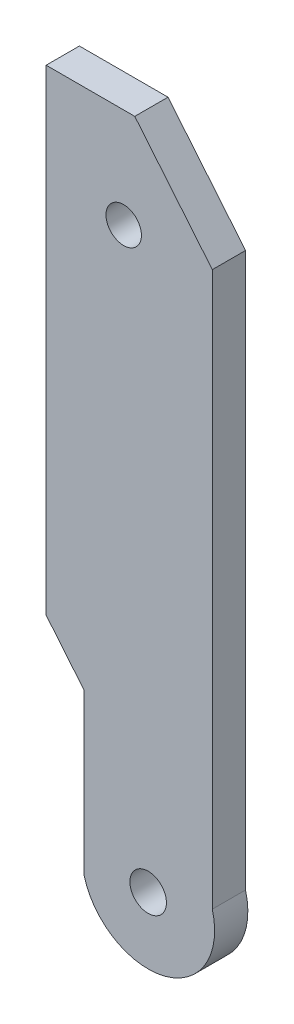
ISO-10303-21;
HEADER;
FILE_DESCRIPTION(('STEP AP214'),'2;1');
FILE_NAME('part.step','',(''),(''),'','','');
FILE_SCHEMA(('AUTOMOTIVE_DESIGN { 1 0 10303 214 1 1 1 1 }'));
ENDSEC;
DATA;
#1=APPLICATION_CONTEXT('core data for automotive mechanical design processes');
#2=APPLICATION_PROTOCOL_DEFINITION('international standard','automotive_design',2000,#1);
#3=PRODUCT_CONTEXT('',#1,'mechanical');
#4=PRODUCT('Part','Part','',(#3));
#5=PRODUCT_RELATED_PRODUCT_CATEGORY('part','',(#4));
#6=PRODUCT_DEFINITION_FORMATION('','',#4);
#7=PRODUCT_DEFINITION_CONTEXT('part definition',#1,'design');
#8=PRODUCT_DEFINITION('design','',#6,#7);
#9=PRODUCT_DEFINITION_SHAPE('','',#8);
#10=(LENGTH_UNIT() NAMED_UNIT(*) SI_UNIT(.MILLI.,.METRE.));
#11=(NAMED_UNIT(*) PLANE_ANGLE_UNIT() SI_UNIT($,.RADIAN.));
#12=(NAMED_UNIT(*) SI_UNIT($,.STERADIAN.) SOLID_ANGLE_UNIT());
#13=UNCERTAINTY_MEASURE_WITH_UNIT(LENGTH_MEASURE(1.E-05),#10,'distance_accuracy_value','');
#14=(GEOMETRIC_REPRESENTATION_CONTEXT(3) GLOBAL_UNCERTAINTY_ASSIGNED_CONTEXT((#13)) GLOBAL_UNIT_ASSIGNED_CONTEXT((#10,
#11,#12)) REPRESENTATION_CONTEXT('',''));
#15=CARTESIAN_POINT('',(0.,0.,0.));
#16=DIRECTION('',(0.,0.,1.));
#17=DIRECTION('',(1.,0.,0.));
#18=AXIS2_PLACEMENT_3D('',#15,#16,#17);
#19=CARTESIAN_POINT('',(28.4405752225166,38.0127221566126,3.));
#20=DIRECTION('',(0.,0.,-1.));
#21=DIRECTION('',(-1.,0.,0.));
#22=AXIS2_PLACEMENT_3D('',#19,#20,#21);
#23=CYLINDRICAL_SURFACE('',#22,6.00000000000001);
#24=CARTESIAN_POINT('',(28.4405752225166,38.0127221566126,0.));
#25=DIRECTION('',(0.,0.,1.));
#26=DIRECTION('',(1.,0.,0.));
#27=AXIS2_PLACEMENT_3D('',#24,#25,#26);
#28=CIRCLE('',#27,6.00000000000001);
#29=CARTESIAN_POINT('',(34.23086743438,39.5851457958505,0.));
#30=VERTEX_POINT('',#29);
#31=CARTESIAN_POINT('',(22.6502830106532,36.4402985173747,0.));
#32=VERTEX_POINT('',#31);
#33=EDGE_CURVE('E141',#30,#32,#28,.F.);
#34=ORIENTED_EDGE('',*,*,#33,.F.);
#35=DIRECTION('',(0.,0.,-1.));
#36=VECTOR('',#35,1.);
#37=CARTESIAN_POINT('',(34.23086743438,39.5851457958505,3.));
#38=LINE('',#37,#36);
#39=CARTESIAN_POINT('',(34.23086743438,39.5851457958505,3.));
#40=VERTEX_POINT('',#39);
#41=EDGE_CURVE('E11',#40,#30,#38,.T.);
#42=ORIENTED_EDGE('',*,*,#41,.F.);
#43=CARTESIAN_POINT('',(28.4405752225166,38.0127221566126,3.));
#44=DIRECTION('',(0.,0.,1.));
#45=DIRECTION('',(1.,0.,0.));
#46=AXIS2_PLACEMENT_3D('',#43,#44,#45);
#47=CIRCLE('',#46,6.00000000000001);
#48=CARTESIAN_POINT('',(22.6502830106532,36.4402985173747,3.));
#49=VERTEX_POINT('',#48);
#50=EDGE_CURVE('E205',#40,#49,#47,.F.);
#51=ORIENTED_EDGE('',*,*,#50,.T.);
#52=DIRECTION('',(0.,0.,-1.));
#53=VECTOR('',#52,1.);
#54=CARTESIAN_POINT('',(22.6502830106532,36.4402985173747,3.));
#55=LINE('',#54,#53);
#56=EDGE_CURVE('E82',#49,#32,#55,.T.);
#57=ORIENTED_EDGE('',*,*,#56,.T.);
#58=EDGE_LOOP('',(#34,#42,#51,#57));
#59=FACE_BOUND('',#58,.T.);
#60=ADVANCED_FACE('F34',(#59),#23,.T.);
#61=CARTESIAN_POINT('',(34.23086743438,0.,3.));
#62=DIRECTION('',(-1.,0.,0.));
#63=DIRECTION('',(0.,0.,1.));
#64=AXIS2_PLACEMENT_3D('',#61,#62,#63);
#65=PLANE('',#64);
#66=DIRECTION('',(0.,1.,0.));
#67=VECTOR('',#66,1.);
#68=CARTESIAN_POINT('',(34.23086743438,0.,0.));
#69=LINE('',#68,#67);
#70=CARTESIAN_POINT('',(34.23086743438,89.5851457958505,0.));
#71=VERTEX_POINT('',#70);
#72=EDGE_CURVE('E139',#30,#71,#69,.T.);
#73=ORIENTED_EDGE('',*,*,#72,.T.);
#74=DIRECTION('',(0.,0.,-1.));
#75=VECTOR('',#74,1.);
#76=CARTESIAN_POINT('',(34.23086743438,89.5851457958505,3.));
#77=LINE('',#76,#75);
#78=CARTESIAN_POINT('',(34.23086743438,89.5851457958505,3.));
#79=VERTEX_POINT('',#78);
#80=EDGE_CURVE('E43',#79,#71,#77,.T.);
#81=ORIENTED_EDGE('',*,*,#80,.F.);
#82=DIRECTION('',(0.,1.,0.));
#83=VECTOR('',#82,1.);
#84=CARTESIAN_POINT('',(34.23086743438,0.,3.));
#85=LINE('',#84,#83);
#86=EDGE_CURVE('E207',#40,#79,#85,.T.);
#87=ORIENTED_EDGE('',*,*,#86,.F.);
#88=ORIENTED_EDGE('',*,*,#41,.T.);
#89=EDGE_LOOP('',(#73,#81,#87,#88));
#90=FACE_BOUND('',#89,.T.);
#91=ADVANCED_FACE('F140',(#90),#65,.F.);
#92=CARTESIAN_POINT('',(64.3446994916133,53.0816689012521,3.));
#93=DIRECTION('',(-0.77138921583987,-0.636363636363636,0.));
#94=DIRECTION('',(0.636363636363636,-0.77138921583987,0.));
#95=AXIS2_PLACEMENT_3D('',#92,#93,#94);
#96=PLANE('',#95);
#97=DIRECTION('',(-0.636363636363636,0.77138921583987,0.));
#98=VECTOR('',#97,1.);
#99=CARTESIAN_POINT('',(64.3446994916133,53.0816689012521,0.));
#100=LINE('',#99,#98);
#101=CARTESIAN_POINT('',(27.23086743438,98.0704271700891,0.));
#102=VERTEX_POINT('',#101);
#103=EDGE_CURVE('E134',#71,#102,#100,.T.);
#104=ORIENTED_EDGE('',*,*,#103,.T.);
#105=DIRECTION('',(0.,0.,-1.));
#106=VECTOR('',#105,1.);
#107=CARTESIAN_POINT('',(27.23086743438,98.0704271700891,3.));
#108=LINE('',#107,#106);
#109=CARTESIAN_POINT('',(27.23086743438,98.0704271700891,3.));
#110=VERTEX_POINT('',#109);
#111=EDGE_CURVE('E121',#110,#102,#108,.T.);
#112=ORIENTED_EDGE('',*,*,#111,.F.);
#113=DIRECTION('',(-0.636363636363636,0.77138921583987,0.));
#114=VECTOR('',#113,1.);
#115=CARTESIAN_POINT('',(64.3446994916133,53.0816689012521,3.));
#116=LINE('',#115,#114);
#117=EDGE_CURVE('E135',#79,#110,#116,.T.);
#118=ORIENTED_EDGE('',*,*,#117,.F.);
#119=ORIENTED_EDGE('',*,*,#80,.T.);
#120=EDGE_LOOP('',(#104,#112,#118,#119));
#121=FACE_BOUND('',#120,.T.);
#122=ADVANCED_FACE('F132',(#121),#96,.F.);
#123=CARTESIAN_POINT('',(0.,98.0704271700891,3.));
#124=DIRECTION('',(0.,-1.,0.));
#125=DIRECTION('',(0.,0.,-1.));
#126=AXIS2_PLACEMENT_3D('',#123,#124,#125);
#127=PLANE('',#126);
#128=DIRECTION('',(-1.,0.,0.));
#129=VECTOR('',#128,1.);
#130=CARTESIAN_POINT('',(0.,98.0704271700891,0.));
#131=LINE('',#130,#129);
#132=CARTESIAN_POINT('',(19.23086743438,98.0704271700891,0.));
#133=VERTEX_POINT('',#132);
#134=EDGE_CURVE('E143',#102,#133,#131,.T.);
#135=ORIENTED_EDGE('',*,*,#134,.T.);
#136=DIRECTION('',(0.,0.,-1.));
#137=VECTOR('',#136,1.);
#138=CARTESIAN_POINT('',(19.23086743438,98.0704271700891,3.));
#139=LINE('',#138,#137);
#140=CARTESIAN_POINT('',(19.23086743438,98.0704271700891,3.));
#141=VERTEX_POINT('',#140);
#142=EDGE_CURVE('E119',#141,#133,#139,.T.);
#143=ORIENTED_EDGE('',*,*,#142,.F.);
#144=DIRECTION('',(-1.,0.,0.));
#145=VECTOR('',#144,1.);
#146=CARTESIAN_POINT('',(0.,98.0704271700891,3.));
#147=LINE('',#146,#145);
#148=EDGE_CURVE('E112',#110,#141,#147,.T.);
#149=ORIENTED_EDGE('',*,*,#148,.F.);
#150=ORIENTED_EDGE('',*,*,#111,.T.);
#151=EDGE_LOOP('',(#135,#143,#149,#150));
#152=FACE_BOUND('',#151,.T.);
#153=ADVANCED_FACE('F184',(#152),#127,.F.);
#154=CARTESIAN_POINT('',(19.23086743438,0.,3.));
#155=DIRECTION('',(1.,0.,0.));
#156=DIRECTION('',(0.,1.,0.));
#157=AXIS2_PLACEMENT_3D('',#154,#155,#156);
#158=PLANE('',#157);
#159=DIRECTION('',(0.,-1.,0.));
#160=VECTOR('',#159,1.);
#161=CARTESIAN_POINT('',(19.23086743438,0.,0.));
#162=LINE('',#161,#160);
#163=CARTESIAN_POINT('',(19.23086743438,55.070526621373,0.));
#164=VERTEX_POINT('',#163);
#165=EDGE_CURVE('E118',#133,#164,#162,.T.);
#166=ORIENTED_EDGE('',*,*,#165,.T.);
#167=DIRECTION('',(0.,0.,-1.));
#168=VECTOR('',#167,1.);
#169=CARTESIAN_POINT('',(19.23086743438,55.070526621373,3.));
#170=LINE('',#169,#168);
#171=CARTESIAN_POINT('',(19.23086743438,55.070526621373,3.));
#172=VERTEX_POINT('',#171);
#173=EDGE_CURVE('E104',#172,#164,#170,.T.);
#174=ORIENTED_EDGE('',*,*,#173,.F.);
#175=DIRECTION('',(0.,-1.,0.));
#176=VECTOR('',#175,1.);
#177=CARTESIAN_POINT('',(19.23086743438,0.,3.));
#178=LINE('',#177,#176);
#179=EDGE_CURVE('E107',#141,#172,#178,.T.);
#180=ORIENTED_EDGE('',*,*,#179,.F.);
#181=ORIENTED_EDGE('',*,*,#142,.T.);
#182=EDGE_LOOP('',(#166,#174,#180,#181));
#183=FACE_BOUND('',#182,.T.);
#184=ADVANCED_FACE('F117',(#183),#158,.F.);
#185=CARTESIAN_POINT('',(38.4764037350767,31.7414136628683,3.));
#186=DIRECTION('',(0.771389215839869,0.636363636363638,0.));
#187=DIRECTION('',(-0.636363636363638,0.771389215839869,0.));
#188=AXIS2_PLACEMENT_3D('',#185,#186,#187);
#189=PLANE('',#188);
#190=DIRECTION('',(0.636363636363638,-0.771389215839869,0.));
#191=VECTOR('',#190,1.);
#192=CARTESIAN_POINT('',(38.4764037350767,31.7414136628683,0.));
#193=LINE('',#192,#191);
#194=CARTESIAN_POINT('',(22.6502830106533,50.9255690070684,0.));
#195=VERTEX_POINT('',#194);
#196=EDGE_CURVE('E152',#164,#195,#193,.T.);
#197=ORIENTED_EDGE('',*,*,#196,.T.);
#198=DIRECTION('',(0.,0.,-1.));
#199=VECTOR('',#198,1.);
#200=CARTESIAN_POINT('',(22.6502830106533,50.9255690070684,3.));
#201=LINE('',#200,#199);
#202=CARTESIAN_POINT('',(22.6502830106533,50.9255690070684,3.));
#203=VERTEX_POINT('',#202);
#204=EDGE_CURVE('E106',#203,#195,#201,.T.);
#205=ORIENTED_EDGE('',*,*,#204,.F.);
#206=DIRECTION('',(0.636363636363638,-0.771389215839869,0.));
#207=VECTOR('',#206,1.);
#208=CARTESIAN_POINT('',(38.4764037350767,31.7414136628683,3.));
#209=LINE('',#208,#207);
#210=EDGE_CURVE('E99',#172,#203,#209,.T.);
#211=ORIENTED_EDGE('',*,*,#210,.F.);
#212=ORIENTED_EDGE('',*,*,#173,.T.);
#213=EDGE_LOOP('',(#197,#205,#211,#212));
#214=FACE_BOUND('',#213,.T.);
#215=ADVANCED_FACE('F102',(#214),#189,.F.);
#216=CARTESIAN_POINT('',(28.4405752225167,38.0127221566126,3.));
#217=DIRECTION('',(0.,0.,-1.));
#218=DIRECTION('',(-1.,0.,0.));
#219=AXIS2_PLACEMENT_3D('',#216,#217,#218);
#220=CYLINDRICAL_SURFACE('',#219,1.65);
#221=CARTESIAN_POINT('',(28.4405752225167,38.0127221566126,3.));
#222=DIRECTION('',(0.,0.,1.));
#223=DIRECTION('',(1.,0.,0.));
#224=AXIS2_PLACEMENT_3D('',#221,#222,#223);
#225=CIRCLE('',#224,1.65);
#226=CARTESIAN_POINT('',(30.0905752225167,38.0127221566126,3.));
#227=VERTEX_POINT('',#226);
#228=EDGE_CURVE('E204',#227,#227,#225,.T.);
#229=ORIENTED_EDGE('',*,*,#228,.T.);
#230=EDGE_LOOP('',(#229));
#231=FACE_BOUND('',#230,.T.);
#232=CARTESIAN_POINT('',(28.4405752225167,38.0127221566126,0.));
#233=DIRECTION('',(0.,0.,1.));
#234=DIRECTION('',(1.,0.,0.));
#235=AXIS2_PLACEMENT_3D('',#232,#233,#234);
#236=CIRCLE('',#235,1.65);
#237=CARTESIAN_POINT('',(30.0905752225167,38.0127221566126,0.));
#238=VERTEX_POINT('',#237);
#239=EDGE_CURVE('E145',#238,#238,#236,.T.);
#240=ORIENTED_EDGE('',*,*,#239,.F.);
#241=EDGE_LOOP('',(#240));
#242=FACE_BOUND('',#241,.T.);
#243=ADVANCED_FACE('F164',(#231,#242),#220,.F.);
#244=CARTESIAN_POINT('',(26.2308674343795,89.0704271700891,3.));
#245=DIRECTION('',(0.,0.,-1.));
#246=DIRECTION('',(-1.,0.,0.));
#247=AXIS2_PLACEMENT_3D('',#244,#245,#246);
#248=CYLINDRICAL_SURFACE('',#247,1.60000000000001);
#249=CARTESIAN_POINT('',(26.2308674343795,89.0704271700891,3.));
#250=DIRECTION('',(0.,0.,1.));
#251=DIRECTION('',(1.,0.,0.));
#252=AXIS2_PLACEMENT_3D('',#249,#250,#251);
#253=CIRCLE('',#252,1.60000000000001);
#254=CARTESIAN_POINT('',(27.8308674343795,89.0704271700891,3.));
#255=VERTEX_POINT('',#254);
#256=EDGE_CURVE('E154',#255,#255,#253,.T.);
#257=ORIENTED_EDGE('',*,*,#256,.T.);
#258=EDGE_LOOP('',(#257));
#259=FACE_BOUND('',#258,.T.);
#260=CARTESIAN_POINT('',(26.2308674343795,89.0704271700891,0.));
#261=DIRECTION('',(0.,0.,1.));
#262=DIRECTION('',(1.,0.,0.));
#263=AXIS2_PLACEMENT_3D('',#260,#261,#262);
#264=CIRCLE('',#263,1.60000000000001);
#265=CARTESIAN_POINT('',(27.8308674343795,89.0704271700891,0.));
#266=VERTEX_POINT('',#265);
#267=EDGE_CURVE('E157',#266,#266,#264,.T.);
#268=ORIENTED_EDGE('',*,*,#267,.F.);
#269=EDGE_LOOP('',(#268));
#270=FACE_BOUND('',#269,.T.);
#271=ADVANCED_FACE('F36',(#259,#270),#248,.F.);
#272=CARTESIAN_POINT('',(22.6502830106532,0.,3.));
#273=DIRECTION('',(1.,0.,0.));
#274=DIRECTION('',(0.,1.,0.));
#275=AXIS2_PLACEMENT_3D('',#272,#273,#274);
#276=PLANE('',#275);
#277=DIRECTION('',(0.,-1.,0.));
#278=VECTOR('',#277,1.);
#279=CARTESIAN_POINT('',(22.6502830106532,0.,0.));
#280=LINE('',#279,#278);
#281=EDGE_CURVE('E75',#195,#32,#280,.T.);
#282=ORIENTED_EDGE('',*,*,#281,.T.);
#283=ORIENTED_EDGE('',*,*,#56,.F.);
#284=DIRECTION('',(0.,-1.,0.));
#285=VECTOR('',#284,1.);
#286=CARTESIAN_POINT('',(22.6502830106532,0.,3.));
#287=LINE('',#286,#285);
#288=EDGE_CURVE('E51',#203,#49,#287,.T.);
#289=ORIENTED_EDGE('',*,*,#288,.F.);
#290=ORIENTED_EDGE('',*,*,#204,.T.);
#291=EDGE_LOOP('',(#282,#283,#289,#290));
#292=FACE_BOUND('',#291,.T.);
#293=ADVANCED_FACE('F171',(#292),#276,.F.);
#294=CARTESIAN_POINT('',(0.,0.,3.));
#295=DIRECTION('',(0.,0.,1.));
#296=DIRECTION('',(1.,0.,0.));
#297=AXIS2_PLACEMENT_3D('',#294,#295,#296);
#298=PLANE('',#297);
#299=ORIENTED_EDGE('',*,*,#256,.F.);
#300=EDGE_LOOP('',(#299));
#301=FACE_BOUND('',#300,.T.);
#302=ORIENTED_EDGE('',*,*,#228,.F.);
#303=EDGE_LOOP('',(#302));
#304=FACE_BOUND('',#303,.T.);
#305=ORIENTED_EDGE('',*,*,#50,.F.);
#306=ORIENTED_EDGE('',*,*,#86,.T.);
#307=ORIENTED_EDGE('',*,*,#117,.T.);
#308=ORIENTED_EDGE('',*,*,#148,.T.);
#309=ORIENTED_EDGE('',*,*,#179,.T.);
#310=ORIENTED_EDGE('',*,*,#210,.T.);
#311=ORIENTED_EDGE('',*,*,#288,.T.);
#312=EDGE_LOOP('',(#305,#306,#307,#308,#309,#310,#311));
#313=FACE_BOUND('',#312,.T.);
#314=ADVANCED_FACE('F110',(#301,#304,#313),#298,.T.);
#315=CARTESIAN_POINT('',(0.,0.,0.));
#316=DIRECTION('',(0.,0.,1.));
#317=DIRECTION('',(1.,0.,0.));
#318=AXIS2_PLACEMENT_3D('',#315,#316,#317);
#319=PLANE('',#318);
#320=ORIENTED_EDGE('',*,*,#267,.T.);
#321=EDGE_LOOP('',(#320));
#322=FACE_BOUND('',#321,.T.);
#323=ORIENTED_EDGE('',*,*,#239,.T.);
#324=EDGE_LOOP('',(#323));
#325=FACE_BOUND('',#324,.T.);
#326=ORIENTED_EDGE('',*,*,#33,.T.);
#327=ORIENTED_EDGE('',*,*,#281,.F.);
#328=ORIENTED_EDGE('',*,*,#196,.F.);
#329=ORIENTED_EDGE('',*,*,#165,.F.);
#330=ORIENTED_EDGE('',*,*,#134,.F.);
#331=ORIENTED_EDGE('',*,*,#103,.F.);
#332=ORIENTED_EDGE('',*,*,#72,.F.);
#333=EDGE_LOOP('',(#326,#327,#328,#329,#330,#331,#332));
#334=FACE_BOUND('',#333,.T.);
#335=ADVANCED_FACE('F162',(#322,#325,#334),#319,.F.);
#336=CLOSED_SHELL('',(#60,#91,#122,#153,#184,#215,#243,#271,#293,#314,#335));
#337=MANIFOLD_SOLID_BREP('B2',#336);
#338=ADVANCED_BREP_SHAPE_REPRESENTATION('',(#18,#337),#14);
#339=SHAPE_DEFINITION_REPRESENTATION(#9,#338);
ENDSEC;
END-ISO-10303-21;
